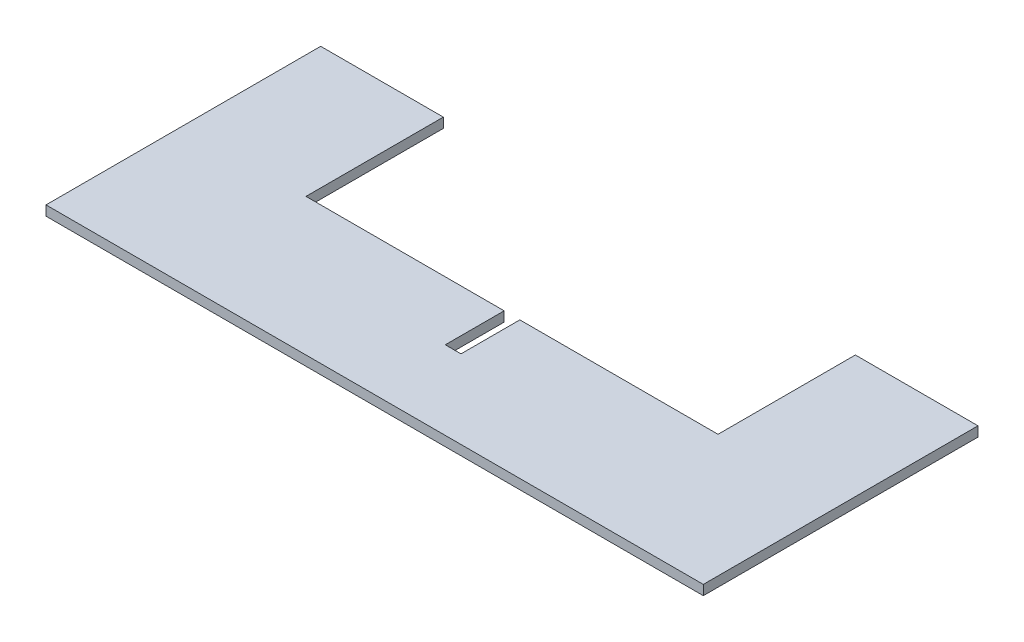
ISO-10303-21;
HEADER;
FILE_DESCRIPTION(('STEP AP214'),'2;1');
FILE_NAME('part.step','',(''),(''),'','','');
FILE_SCHEMA(('AUTOMOTIVE_DESIGN { 1 0 10303 214 1 1 1 1 }'));
ENDSEC;
DATA;
#1=APPLICATION_CONTEXT('core data for automotive mechanical design processes');
#2=APPLICATION_PROTOCOL_DEFINITION('international standard','automotive_design',2000,#1);
#3=PRODUCT_CONTEXT('',#1,'mechanical');
#4=PRODUCT('Part','Part','',(#3));
#5=PRODUCT_RELATED_PRODUCT_CATEGORY('part','',(#4));
#6=PRODUCT_DEFINITION_FORMATION('','',#4);
#7=PRODUCT_DEFINITION_CONTEXT('part definition',#1,'design');
#8=PRODUCT_DEFINITION('design','',#6,#7);
#9=PRODUCT_DEFINITION_SHAPE('','',#8);
#10=(LENGTH_UNIT() NAMED_UNIT(*) SI_UNIT(.MILLI.,.METRE.));
#11=(NAMED_UNIT(*) PLANE_ANGLE_UNIT() SI_UNIT($,.RADIAN.));
#12=(NAMED_UNIT(*) SI_UNIT($,.STERADIAN.) SOLID_ANGLE_UNIT());
#13=UNCERTAINTY_MEASURE_WITH_UNIT(LENGTH_MEASURE(1.E-05),#10,'distance_accuracy_value','');
#14=(GEOMETRIC_REPRESENTATION_CONTEXT(3) GLOBAL_UNCERTAINTY_ASSIGNED_CONTEXT((#13)) GLOBAL_UNIT_ASSIGNED_CONTEXT((#10,
#11,#12)) REPRESENTATION_CONTEXT('',''));
#15=CARTESIAN_POINT('',(0.,0.,0.));
#16=DIRECTION('',(0.,0.,1.));
#17=DIRECTION('',(1.,0.,0.));
#18=AXIS2_PLACEMENT_3D('',#15,#16,#17);
#19=CARTESIAN_POINT('',(33.5,0.5,0.));
#20=DIRECTION('',(-1.,0.,0.));
#21=DIRECTION('',(0.,0.,1.));
#22=AXIS2_PLACEMENT_3D('',#19,#20,#21);
#23=PLANE('',#22);
#24=DIRECTION('',(0.,0.,-1.));
#25=VECTOR('',#24,1.);
#26=CARTESIAN_POINT('',(33.5,0.,0.));
#27=LINE('',#26,#25);
#28=CARTESIAN_POINT('',(33.5,0.,0.));
#29=VERTEX_POINT('',#28);
#30=CARTESIAN_POINT('',(33.5,0.,-14.));
#31=VERTEX_POINT('',#30);
#32=EDGE_CURVE('E153',#29,#31,#27,.T.);
#33=ORIENTED_EDGE('',*,*,#32,.T.);
#34=DIRECTION('',(0.,-1.,0.));
#35=VECTOR('',#34,1.);
#36=CARTESIAN_POINT('',(33.5,0.5,-14.));
#37=LINE('',#36,#35);
#38=CARTESIAN_POINT('',(33.5,0.5,-14.));
#39=VERTEX_POINT('',#38);
#40=EDGE_CURVE('E11',#39,#31,#37,.T.);
#41=ORIENTED_EDGE('',*,*,#40,.F.);
#42=DIRECTION('',(0.,0.,-1.));
#43=VECTOR('',#42,1.);
#44=CARTESIAN_POINT('',(33.5,0.5,0.));
#45=LINE('',#44,#43);
#46=CARTESIAN_POINT('',(33.5,0.5,0.));
#47=VERTEX_POINT('',#46);
#48=EDGE_CURVE('E175',#47,#39,#45,.T.);
#49=ORIENTED_EDGE('',*,*,#48,.F.);
#50=DIRECTION('',(0.,-1.,0.));
#51=VECTOR('',#50,1.);
#52=CARTESIAN_POINT('',(33.5,0.5,0.));
#53=LINE('',#52,#51);
#54=EDGE_CURVE('E149',#47,#29,#53,.T.);
#55=ORIENTED_EDGE('',*,*,#54,.T.);
#56=EDGE_LOOP('',(#33,#41,#49,#55));
#57=FACE_BOUND('',#56,.T.);
#58=ADVANCED_FACE('F33',(#57),#23,.F.);
#59=CARTESIAN_POINT('',(33.5,0.5,-14.));
#60=DIRECTION('',(0.,0.,1.));
#61=DIRECTION('',(1.,0.,0.));
#62=AXIS2_PLACEMENT_3D('',#59,#60,#61);
#63=PLANE('',#62);
#64=DIRECTION('',(-1.,0.,0.));
#65=VECTOR('',#64,1.);
#66=CARTESIAN_POINT('',(33.5,0.,-14.));
#67=LINE('',#66,#65);
#68=CARTESIAN_POINT('',(27.25,0.,-14.));
#69=VERTEX_POINT('',#68);
#70=EDGE_CURVE('E156',#31,#69,#67,.T.);
#71=ORIENTED_EDGE('',*,*,#70,.T.);
#72=DIRECTION('',(0.,-1.,0.));
#73=VECTOR('',#72,1.);
#74=CARTESIAN_POINT('',(27.25,0.5,-14.));
#75=LINE('',#74,#73);
#76=CARTESIAN_POINT('',(27.25,0.5,-14.));
#77=VERTEX_POINT('',#76);
#78=EDGE_CURVE('E41',#77,#69,#75,.T.);
#79=ORIENTED_EDGE('',*,*,#78,.F.);
#80=DIRECTION('',(-1.,0.,0.));
#81=VECTOR('',#80,1.);
#82=CARTESIAN_POINT('',(33.5,0.5,-14.));
#83=LINE('',#82,#81);
#84=EDGE_CURVE('E104',#39,#77,#83,.T.);
#85=ORIENTED_EDGE('',*,*,#84,.F.);
#86=ORIENTED_EDGE('',*,*,#40,.T.);
#87=EDGE_LOOP('',(#71,#79,#85,#86));
#88=FACE_BOUND('',#87,.T.);
#89=ADVANCED_FACE('F253',(#88),#63,.F.);
#90=CARTESIAN_POINT('',(27.25,0.5,-14.));
#91=DIRECTION('',(1.,0.,0.));
#92=DIRECTION('',(0.,0.,-1.));
#93=AXIS2_PLACEMENT_3D('',#90,#91,#92);
#94=PLANE('',#93);
#95=DIRECTION('',(0.,0.,1.));
#96=VECTOR('',#95,1.);
#97=CARTESIAN_POINT('',(27.25,0.,-14.));
#98=LINE('',#97,#96);
#99=CARTESIAN_POINT('',(27.25,0.,-7.));
#100=VERTEX_POINT('',#99);
#101=EDGE_CURVE('E158',#69,#100,#98,.T.);
#102=ORIENTED_EDGE('',*,*,#101,.T.);
#103=DIRECTION('',(0.,-1.,0.));
#104=VECTOR('',#103,1.);
#105=CARTESIAN_POINT('',(27.25,0.5,-7.));
#106=LINE('',#105,#104);
#107=CARTESIAN_POINT('',(27.25,0.5,-7.));
#108=VERTEX_POINT('',#107);
#109=EDGE_CURVE('E194',#108,#100,#106,.T.);
#110=ORIENTED_EDGE('',*,*,#109,.F.);
#111=DIRECTION('',(0.,0.,1.));
#112=VECTOR('',#111,1.);
#113=CARTESIAN_POINT('',(27.25,0.5,-14.));
#114=LINE('',#113,#112);
#115=EDGE_CURVE('E202',#77,#108,#114,.T.);
#116=ORIENTED_EDGE('',*,*,#115,.F.);
#117=ORIENTED_EDGE('',*,*,#78,.T.);
#118=EDGE_LOOP('',(#102,#110,#116,#117));
#119=FACE_BOUND('',#118,.T.);
#120=ADVANCED_FACE('F200',(#119),#94,.F.);
#121=CARTESIAN_POINT('',(27.25,0.5,-7.));
#122=DIRECTION('',(0.,0.,1.));
#123=DIRECTION('',(1.,0.,0.));
#124=AXIS2_PLACEMENT_3D('',#121,#122,#123);
#125=PLANE('',#124);
#126=DIRECTION('',(-1.,0.,0.));
#127=VECTOR('',#126,1.);
#128=CARTESIAN_POINT('',(27.25,0.,-7.));
#129=LINE('',#128,#127);
#130=CARTESIAN_POINT('',(17.15,0.,-7.));
#131=VERTEX_POINT('',#130);
#132=EDGE_CURVE('E160',#100,#131,#129,.T.);
#133=ORIENTED_EDGE('',*,*,#132,.T.);
#134=DIRECTION('',(0.,-1.,0.));
#135=VECTOR('',#134,1.);
#136=CARTESIAN_POINT('',(17.15,0.5,-7.));
#137=LINE('',#136,#135);
#138=CARTESIAN_POINT('',(17.15,0.5,-7.));
#139=VERTEX_POINT('',#138);
#140=EDGE_CURVE('E191',#139,#131,#137,.T.);
#141=ORIENTED_EDGE('',*,*,#140,.F.);
#142=DIRECTION('',(-1.,0.,0.));
#143=VECTOR('',#142,1.);
#144=CARTESIAN_POINT('',(27.25,0.5,-7.));
#145=LINE('',#144,#143);
#146=EDGE_CURVE('E220',#108,#139,#145,.T.);
#147=ORIENTED_EDGE('',*,*,#146,.F.);
#148=ORIENTED_EDGE('',*,*,#109,.T.);
#149=EDGE_LOOP('',(#133,#141,#147,#148));
#150=FACE_BOUND('',#149,.T.);
#151=ADVANCED_FACE('F211',(#150),#125,.F.);
#152=CARTESIAN_POINT('',(17.15,0.5,-7.));
#153=DIRECTION('',(1.,0.,0.));
#154=DIRECTION('',(0.,0.,-1.));
#155=AXIS2_PLACEMENT_3D('',#152,#153,#154);
#156=PLANE('',#155);
#157=DIRECTION('',(0.,0.,1.));
#158=VECTOR('',#157,1.);
#159=CARTESIAN_POINT('',(17.15,0.,-7.));
#160=LINE('',#159,#158);
#161=CARTESIAN_POINT('',(17.15,0.,-4.));
#162=VERTEX_POINT('',#161);
#163=EDGE_CURVE('E162',#131,#162,#160,.T.);
#164=ORIENTED_EDGE('',*,*,#163,.T.);
#165=DIRECTION('',(0.,-1.,0.));
#166=VECTOR('',#165,1.);
#167=CARTESIAN_POINT('',(17.15,0.5,-4.));
#168=LINE('',#167,#166);
#169=CARTESIAN_POINT('',(17.15,0.5,-4.));
#170=VERTEX_POINT('',#169);
#171=EDGE_CURVE('E188',#170,#162,#168,.T.);
#172=ORIENTED_EDGE('',*,*,#171,.F.);
#173=DIRECTION('',(0.,0.,1.));
#174=VECTOR('',#173,1.);
#175=CARTESIAN_POINT('',(17.15,0.5,-7.));
#176=LINE('',#175,#174);
#177=EDGE_CURVE('E217',#139,#170,#176,.T.);
#178=ORIENTED_EDGE('',*,*,#177,.F.);
#179=ORIENTED_EDGE('',*,*,#140,.T.);
#180=EDGE_LOOP('',(#164,#172,#178,#179));
#181=FACE_BOUND('',#180,.T.);
#182=ADVANCED_FACE('F215',(#181),#156,.F.);
#183=CARTESIAN_POINT('',(17.15,0.5,-4.));
#184=DIRECTION('',(0.,0.,1.));
#185=DIRECTION('',(1.,0.,0.));
#186=AXIS2_PLACEMENT_3D('',#183,#184,#185);
#187=PLANE('',#186);
#188=DIRECTION('',(-1.,0.,0.));
#189=VECTOR('',#188,1.);
#190=CARTESIAN_POINT('',(17.15,0.,-4.));
#191=LINE('',#190,#189);
#192=CARTESIAN_POINT('',(16.35,0.,-4.));
#193=VERTEX_POINT('',#192);
#194=EDGE_CURVE('E164',#162,#193,#191,.T.);
#195=ORIENTED_EDGE('',*,*,#194,.T.);
#196=DIRECTION('',(0.,-1.,0.));
#197=VECTOR('',#196,1.);
#198=CARTESIAN_POINT('',(16.35,0.5,-4.));
#199=LINE('',#198,#197);
#200=CARTESIAN_POINT('',(16.35,0.5,-4.));
#201=VERTEX_POINT('',#200);
#202=EDGE_CURVE('E185',#201,#193,#199,.T.);
#203=ORIENTED_EDGE('',*,*,#202,.F.);
#204=DIRECTION('',(-1.,0.,0.));
#205=VECTOR('',#204,1.);
#206=CARTESIAN_POINT('',(17.15,0.5,-4.));
#207=LINE('',#206,#205);
#208=EDGE_CURVE('E219',#170,#201,#207,.T.);
#209=ORIENTED_EDGE('',*,*,#208,.F.);
#210=ORIENTED_EDGE('',*,*,#171,.T.);
#211=EDGE_LOOP('',(#195,#203,#209,#210));
#212=FACE_BOUND('',#211,.T.);
#213=ADVANCED_FACE('F266',(#212),#187,.F.);
#214=CARTESIAN_POINT('',(16.35,0.5,-4.));
#215=DIRECTION('',(-1.,0.,0.));
#216=DIRECTION('',(0.,0.,1.));
#217=AXIS2_PLACEMENT_3D('',#214,#215,#216);
#218=PLANE('',#217);
#219=DIRECTION('',(0.,0.,-1.));
#220=VECTOR('',#219,1.);
#221=CARTESIAN_POINT('',(16.35,0.,-4.));
#222=LINE('',#221,#220);
#223=CARTESIAN_POINT('',(16.35,0.,-7.));
#224=VERTEX_POINT('',#223);
#225=EDGE_CURVE('E166',#193,#224,#222,.T.);
#226=ORIENTED_EDGE('',*,*,#225,.T.);
#227=DIRECTION('',(0.,-1.,0.));
#228=VECTOR('',#227,1.);
#229=CARTESIAN_POINT('',(16.35,0.5,-7.));
#230=LINE('',#229,#228);
#231=CARTESIAN_POINT('',(16.35,0.5,-7.));
#232=VERTEX_POINT('',#231);
#233=EDGE_CURVE('E182',#232,#224,#230,.T.);
#234=ORIENTED_EDGE('',*,*,#233,.F.);
#235=DIRECTION('',(0.,0.,-1.));
#236=VECTOR('',#235,1.);
#237=CARTESIAN_POINT('',(16.35,0.5,-4.));
#238=LINE('',#237,#236);
#239=EDGE_CURVE('E222',#201,#232,#238,.T.);
#240=ORIENTED_EDGE('',*,*,#239,.F.);
#241=ORIENTED_EDGE('',*,*,#202,.T.);
#242=EDGE_LOOP('',(#226,#234,#240,#241));
#243=FACE_BOUND('',#242,.T.);
#244=ADVANCED_FACE('F269',(#243),#218,.F.);
#245=CARTESIAN_POINT('',(16.35,0.5,-7.));
#246=DIRECTION('',(0.,0.,1.));
#247=DIRECTION('',(1.,0.,0.));
#248=AXIS2_PLACEMENT_3D('',#245,#246,#247);
#249=PLANE('',#248);
#250=DIRECTION('',(-1.,0.,0.));
#251=VECTOR('',#250,1.);
#252=CARTESIAN_POINT('',(16.35,0.,-7.));
#253=LINE('',#252,#251);
#254=CARTESIAN_POINT('',(6.25,0.,-7.));
#255=VERTEX_POINT('',#254);
#256=EDGE_CURVE('E168',#224,#255,#253,.T.);
#257=ORIENTED_EDGE('',*,*,#256,.T.);
#258=DIRECTION('',(0.,-1.,0.));
#259=VECTOR('',#258,1.);
#260=CARTESIAN_POINT('',(6.25,0.5,-7.));
#261=LINE('',#260,#259);
#262=CARTESIAN_POINT('',(6.25,0.5,-7.));
#263=VERTEX_POINT('',#262);
#264=EDGE_CURVE('E179',#263,#255,#261,.T.);
#265=ORIENTED_EDGE('',*,*,#264,.F.);
#266=DIRECTION('',(-1.,0.,0.));
#267=VECTOR('',#266,1.);
#268=CARTESIAN_POINT('',(16.35,0.5,-7.));
#269=LINE('',#268,#267);
#270=EDGE_CURVE('E228',#232,#263,#269,.T.);
#271=ORIENTED_EDGE('',*,*,#270,.F.);
#272=ORIENTED_EDGE('',*,*,#233,.T.);
#273=EDGE_LOOP('',(#257,#265,#271,#272));
#274=FACE_BOUND('',#273,.T.);
#275=ADVANCED_FACE('F234',(#274),#249,.F.);
#276=CARTESIAN_POINT('',(6.25,0.5,-7.));
#277=DIRECTION('',(-1.,0.,0.));
#278=DIRECTION('',(0.,0.,1.));
#279=AXIS2_PLACEMENT_3D('',#276,#277,#278);
#280=PLANE('',#279);
#281=DIRECTION('',(0.,0.,-1.));
#282=VECTOR('',#281,1.);
#283=CARTESIAN_POINT('',(6.25,0.,-7.));
#284=LINE('',#283,#282);
#285=CARTESIAN_POINT('',(6.25,0.,-14.));
#286=VERTEX_POINT('',#285);
#287=EDGE_CURVE('E170',#255,#286,#284,.T.);
#288=ORIENTED_EDGE('',*,*,#287,.T.);
#289=DIRECTION('',(0.,-1.,0.));
#290=VECTOR('',#289,1.);
#291=CARTESIAN_POINT('',(6.25,0.5,-14.));
#292=LINE('',#291,#290);
#293=CARTESIAN_POINT('',(6.25,0.5,-14.));
#294=VERTEX_POINT('',#293);
#295=EDGE_CURVE('E144',#294,#286,#292,.T.);
#296=ORIENTED_EDGE('',*,*,#295,.F.);
#297=DIRECTION('',(0.,0.,-1.));
#298=VECTOR('',#297,1.);
#299=CARTESIAN_POINT('',(6.25,0.5,-7.));
#300=LINE('',#299,#298);
#301=EDGE_CURVE('E135',#263,#294,#300,.T.);
#302=ORIENTED_EDGE('',*,*,#301,.F.);
#303=ORIENTED_EDGE('',*,*,#264,.T.);
#304=EDGE_LOOP('',(#288,#296,#302,#303));
#305=FACE_BOUND('',#304,.T.);
#306=ADVANCED_FACE('F238',(#305),#280,.F.);
#307=CARTESIAN_POINT('',(6.25,0.5,-14.));
#308=DIRECTION('',(0.,0.,1.));
#309=DIRECTION('',(1.,0.,0.));
#310=AXIS2_PLACEMENT_3D('',#307,#308,#309);
#311=PLANE('',#310);
#312=DIRECTION('',(-1.,0.,0.));
#313=VECTOR('',#312,1.);
#314=CARTESIAN_POINT('',(6.25,0.,-14.));
#315=LINE('',#314,#313);
#316=CARTESIAN_POINT('',(0.,0.,-14.));
#317=VERTEX_POINT('',#316);
#318=EDGE_CURVE('E143',#286,#317,#315,.T.);
#319=ORIENTED_EDGE('',*,*,#318,.T.);
#320=DIRECTION('',(0.,-1.,0.));
#321=VECTOR('',#320,1.);
#322=CARTESIAN_POINT('',(0.,0.5,-14.));
#323=LINE('',#322,#321);
#324=CARTESIAN_POINT('',(0.,0.5,-14.));
#325=VERTEX_POINT('',#324);
#326=EDGE_CURVE('E140',#325,#317,#323,.T.);
#327=ORIENTED_EDGE('',*,*,#326,.F.);
#328=DIRECTION('',(-1.,0.,0.));
#329=VECTOR('',#328,1.);
#330=CARTESIAN_POINT('',(6.25,0.5,-14.));
#331=LINE('',#330,#329);
#332=EDGE_CURVE('E129',#294,#325,#331,.T.);
#333=ORIENTED_EDGE('',*,*,#332,.F.);
#334=ORIENTED_EDGE('',*,*,#295,.T.);
#335=EDGE_LOOP('',(#319,#327,#333,#334));
#336=FACE_BOUND('',#335,.T.);
#337=ADVANCED_FACE('F141',(#336),#311,.F.);
#338=CARTESIAN_POINT('',(0.,0.5,-14.));
#339=DIRECTION('',(1.,0.,0.));
#340=DIRECTION('',(0.,0.,-1.));
#341=AXIS2_PLACEMENT_3D('',#338,#339,#340);
#342=PLANE('',#341);
#343=DIRECTION('',(0.,0.,1.));
#344=VECTOR('',#343,1.);
#345=CARTESIAN_POINT('',(0.,0.,-14.));
#346=LINE('',#345,#344);
#347=CARTESIAN_POINT('',(0.,0.,0.));
#348=VERTEX_POINT('',#347);
#349=EDGE_CURVE('E90',#317,#348,#346,.T.);
#350=ORIENTED_EDGE('',*,*,#349,.T.);
#351=DIRECTION('',(0.,-1.,0.));
#352=VECTOR('',#351,1.);
#353=CARTESIAN_POINT('',(0.,0.5,0.));
#354=LINE('',#353,#352);
#355=CARTESIAN_POINT('',(0.,0.5,0.));
#356=VERTEX_POINT('',#355);
#357=EDGE_CURVE('E145',#356,#348,#354,.T.);
#358=ORIENTED_EDGE('',*,*,#357,.F.);
#359=DIRECTION('',(0.,0.,1.));
#360=VECTOR('',#359,1.);
#361=CARTESIAN_POINT('',(0.,0.5,-14.));
#362=LINE('',#361,#360);
#363=EDGE_CURVE('E133',#325,#356,#362,.T.);
#364=ORIENTED_EDGE('',*,*,#363,.F.);
#365=ORIENTED_EDGE('',*,*,#326,.T.);
#366=EDGE_LOOP('',(#350,#358,#364,#365));
#367=FACE_BOUND('',#366,.T.);
#368=ADVANCED_FACE('F147',(#367),#342,.F.);
#369=CARTESIAN_POINT('',(0.,0.5,0.));
#370=DIRECTION('',(0.,0.,-1.));
#371=DIRECTION('',(-1.,0.,0.));
#372=AXIS2_PLACEMENT_3D('',#369,#370,#371);
#373=PLANE('',#372);
#374=DIRECTION('',(1.,0.,0.));
#375=VECTOR('',#374,1.);
#376=CARTESIAN_POINT('',(0.,0.,0.));
#377=LINE('',#376,#375);
#378=EDGE_CURVE('E96',#348,#29,#377,.T.);
#379=ORIENTED_EDGE('',*,*,#378,.T.);
#380=ORIENTED_EDGE('',*,*,#54,.F.);
#381=DIRECTION('',(1.,0.,0.));
#382=VECTOR('',#381,1.);
#383=CARTESIAN_POINT('',(0.,0.5,0.));
#384=LINE('',#383,#382);
#385=EDGE_CURVE('E49',#356,#47,#384,.T.);
#386=ORIENTED_EDGE('',*,*,#385,.F.);
#387=ORIENTED_EDGE('',*,*,#357,.T.);
#388=EDGE_LOOP('',(#379,#380,#386,#387));
#389=FACE_BOUND('',#388,.T.);
#390=ADVANCED_FACE('F242',(#389),#373,.F.);
#391=CARTESIAN_POINT('',(0.,0.5,0.));
#392=DIRECTION('',(0.,1.,0.));
#393=DIRECTION('',(0.,0.,1.));
#394=AXIS2_PLACEMENT_3D('',#391,#392,#393);
#395=PLANE('',#394);
#396=ORIENTED_EDGE('',*,*,#48,.T.);
#397=ORIENTED_EDGE('',*,*,#84,.T.);
#398=ORIENTED_EDGE('',*,*,#115,.T.);
#399=ORIENTED_EDGE('',*,*,#146,.T.);
#400=ORIENTED_EDGE('',*,*,#177,.T.);
#401=ORIENTED_EDGE('',*,*,#208,.T.);
#402=ORIENTED_EDGE('',*,*,#239,.T.);
#403=ORIENTED_EDGE('',*,*,#270,.T.);
#404=ORIENTED_EDGE('',*,*,#301,.T.);
#405=ORIENTED_EDGE('',*,*,#332,.T.);
#406=ORIENTED_EDGE('',*,*,#363,.T.);
#407=ORIENTED_EDGE('',*,*,#385,.T.);
#408=EDGE_LOOP('',(#396,#397,#398,#399,#400,#401,#402,#403,#404,#405,#406,#407));
#409=FACE_BOUND('',#408,.T.);
#410=ADVANCED_FACE('F131',(#409),#395,.T.);
#411=CARTESIAN_POINT('',(0.,0.,0.));
#412=DIRECTION('',(0.,1.,0.));
#413=DIRECTION('',(0.,0.,1.));
#414=AXIS2_PLACEMENT_3D('',#411,#412,#413);
#415=PLANE('',#414);
#416=ORIENTED_EDGE('',*,*,#32,.F.);
#417=ORIENTED_EDGE('',*,*,#378,.F.);
#418=ORIENTED_EDGE('',*,*,#349,.F.);
#419=ORIENTED_EDGE('',*,*,#318,.F.);
#420=ORIENTED_EDGE('',*,*,#287,.F.);
#421=ORIENTED_EDGE('',*,*,#256,.F.);
#422=ORIENTED_EDGE('',*,*,#225,.F.);
#423=ORIENTED_EDGE('',*,*,#194,.F.);
#424=ORIENTED_EDGE('',*,*,#163,.F.);
#425=ORIENTED_EDGE('',*,*,#132,.F.);
#426=ORIENTED_EDGE('',*,*,#101,.F.);
#427=ORIENTED_EDGE('',*,*,#70,.F.);
#428=EDGE_LOOP('',(#416,#417,#418,#419,#420,#421,#422,#423,#424,#425,#426,#427));
#429=FACE_BOUND('',#428,.T.);
#430=ADVANCED_FACE('F206',(#429),#415,.F.);
#431=CLOSED_SHELL('',(#58,#89,#120,#151,#182,#213,#244,#275,#306,#337,#368,#390,#410,#430));
#432=MANIFOLD_SOLID_BREP('B2',#431);
#433=ADVANCED_BREP_SHAPE_REPRESENTATION('',(#18,#432),#14);
#434=SHAPE_DEFINITION_REPRESENTATION(#9,#433);
ENDSEC;
END-ISO-10303-21;
